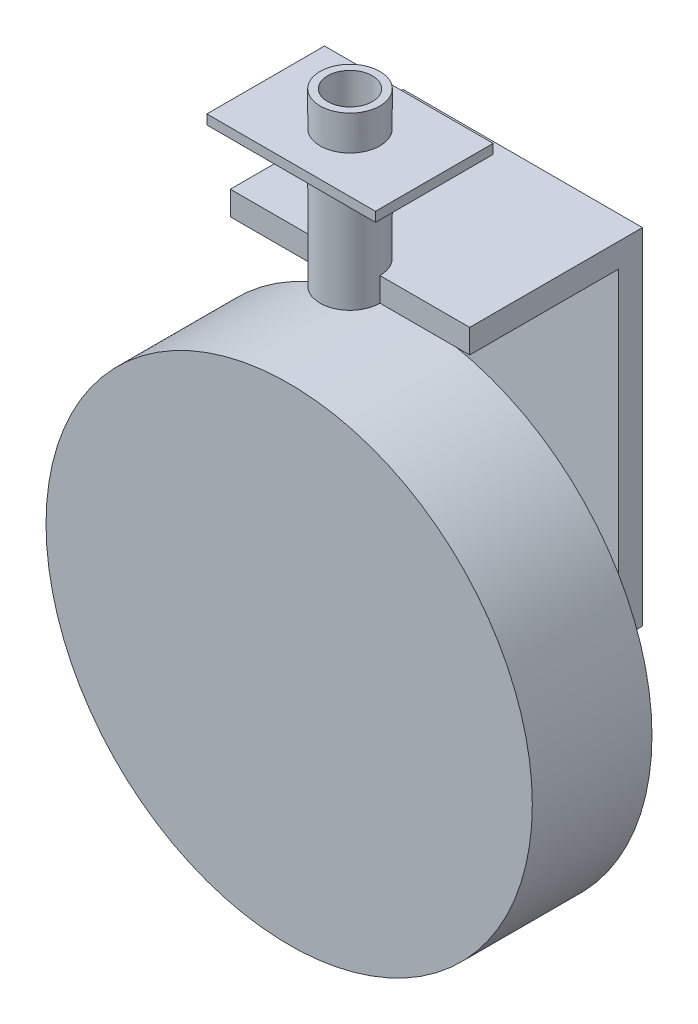
ISO-10303-21;
HEADER;
FILE_DESCRIPTION(('STEP AP214'),'2;1');
FILE_NAME('part.step','',(''),(''),'','','');
FILE_SCHEMA(('AUTOMOTIVE_DESIGN { 1 0 10303 214 1 1 1 1 }'));
ENDSEC;
DATA;
#1=APPLICATION_CONTEXT('core data for automotive mechanical design processes');
#2=APPLICATION_PROTOCOL_DEFINITION('international standard','automotive_design',2000,#1);
#3=PRODUCT_CONTEXT('',#1,'mechanical');
#4=PRODUCT('Part','Part','',(#3));
#5=PRODUCT_RELATED_PRODUCT_CATEGORY('part','',(#4));
#6=PRODUCT_DEFINITION_FORMATION('','',#4);
#7=PRODUCT_DEFINITION_CONTEXT('part definition',#1,'design');
#8=PRODUCT_DEFINITION('design','',#6,#7);
#9=PRODUCT_DEFINITION_SHAPE('','',#8);
#10=(LENGTH_UNIT() NAMED_UNIT(*) SI_UNIT(.MILLI.,.METRE.));
#11=(NAMED_UNIT(*) PLANE_ANGLE_UNIT() SI_UNIT($,.RADIAN.));
#12=(NAMED_UNIT(*) SI_UNIT($,.STERADIAN.) SOLID_ANGLE_UNIT());
#13=UNCERTAINTY_MEASURE_WITH_UNIT(LENGTH_MEASURE(1.E-05),#10,'distance_accuracy_value','');
#14=(GEOMETRIC_REPRESENTATION_CONTEXT(3) GLOBAL_UNCERTAINTY_ASSIGNED_CONTEXT((#13)) GLOBAL_UNIT_ASSIGNED_CONTEXT((#10,
#11,#12)) REPRESENTATION_CONTEXT('',''));
#15=CARTESIAN_POINT('',(0.,0.,0.));
#16=DIRECTION('',(0.,0.,1.));
#17=DIRECTION('',(1.,0.,0.));
#18=AXIS2_PLACEMENT_3D('',#15,#16,#17);
#19=CARTESIAN_POINT('',(0.,124.21820320294,24.5796167587078));
#20=DIRECTION('',(0.,-1.,0.));
#21=DIRECTION('',(0.,0.,-1.));
#22=AXIS2_PLACEMENT_3D('',#19,#20,#21);
#23=CYLINDRICAL_SURFACE('',#22,12.5);
#24=DIRECTION('',(0.,-1.,0.));
#25=VECTOR('',#24,1.);
#26=CARTESIAN_POINT('',(12.5,124.21820320294,24.5796167587078));
#27=LINE('',#26,#25);
#28=CARTESIAN_POINT('',(12.5,134.21820320294,24.5796167587078));
#29=VERTEX_POINT('',#28);
#30=CARTESIAN_POINT('',(12.5,124.21820320294,24.5796167587078));
#31=VERTEX_POINT('',#30);
#32=EDGE_CURVE('E254',#29,#31,#27,.T.);
#33=ORIENTED_EDGE('',*,*,#32,.F.);
#34=CARTESIAN_POINT('',(0.,134.21820320294,24.5796167587078));
#35=DIRECTION('',(0.,1.,0.));
#36=DIRECTION('',(0.,0.,1.));
#37=AXIS2_PLACEMENT_3D('',#34,#35,#36);
#38=CIRCLE('',#37,12.5);
#39=CARTESIAN_POINT('',(-12.5,134.21820320294,24.5796167587078));
#40=VERTEX_POINT('',#39);
#41=EDGE_CURVE('E52',#29,#40,#38,.T.);
#42=ORIENTED_EDGE('',*,*,#41,.T.);
#43=DIRECTION('',(0.,-1.,0.));
#44=VECTOR('',#43,1.);
#45=CARTESIAN_POINT('',(-12.5,124.21820320294,24.5796167587078));
#46=LINE('',#45,#44);
#47=CARTESIAN_POINT('',(-12.5,124.21820320294,24.5796167587078));
#48=VERTEX_POINT('',#47);
#49=EDGE_CURVE('E60',#48,#40,#46,.F.);
#50=ORIENTED_EDGE('',*,*,#49,.F.);
#51=CARTESIAN_POINT('',(0.,124.21820320294,24.5796167587078));
#52=DIRECTION('',(0.,-1.,0.));
#53=DIRECTION('',(0.,0.,-1.));
#54=AXIS2_PLACEMENT_3D('',#51,#52,#53);
#55=CIRCLE('',#54,12.5);
#56=EDGE_CURVE('E181',#31,#48,#55,.T.);
#57=ORIENTED_EDGE('',*,*,#56,.F.);
#58=EDGE_LOOP('',(#33,#42,#50,#57));
#59=FACE_BOUND('',#58,.T.);
#60=CARTESIAN_POINT('',(0.,177.126182074374,24.5796167587078));
#61=DIRECTION('',(0.,1.,0.));
#62=DIRECTION('',(0.,0.,1.));
#63=AXIS2_PLACEMENT_3D('',#60,#61,#62);
#64=CIRCLE('',#63,12.5);
#65=CARTESIAN_POINT('',(0.,177.126182074374,37.0796167587078));
#66=VERTEX_POINT('',#65);
#67=EDGE_CURVE('E164',#66,#66,#64,.F.);
#68=ORIENTED_EDGE('',*,*,#67,.T.);
#69=EDGE_LOOP('',(#68));
#70=FACE_BOUND('',#69,.T.);
#71=ADVANCED_FACE('F34',(#59,#70),#23,.T.);
#72=CARTESIAN_POINT('',(-50.,124.21820320294,24.5796167587078));
#73=DIRECTION('',(0.,0.,-1.));
#74=DIRECTION('',(-1.,0.,0.));
#75=AXIS2_PLACEMENT_3D('',#72,#73,#74);
#76=PLANE('',#75);
#77=DIRECTION('',(1.,0.,0.));
#78=VECTOR('',#77,1.);
#79=CARTESIAN_POINT('',(-50.,134.21820320294,24.5796167587078));
#80=LINE('',#79,#78);
#81=CARTESIAN_POINT('',(50.,134.21820320294,24.5796167587078));
#82=VERTEX_POINT('',#81);
#83=EDGE_CURVE('E220',#29,#82,#80,.T.);
#84=ORIENTED_EDGE('',*,*,#83,.F.);
#85=ORIENTED_EDGE('',*,*,#32,.T.);
#86=DIRECTION('',(1.,0.,0.));
#87=VECTOR('',#86,1.);
#88=CARTESIAN_POINT('',(-50.,124.21820320294,24.5796167587078));
#89=LINE('',#88,#87);
#90=CARTESIAN_POINT('',(50.,124.21820320294,24.5796167587078));
#91=VERTEX_POINT('',#90);
#92=EDGE_CURVE('E234',#31,#91,#89,.T.);
#93=ORIENTED_EDGE('',*,*,#92,.T.);
#94=DIRECTION('',(0.,1.,0.));
#95=VECTOR('',#94,1.);
#96=CARTESIAN_POINT('',(50.,124.21820320294,24.5796167587078));
#97=LINE('',#96,#95);
#98=EDGE_CURVE('E188',#91,#82,#97,.T.);
#99=ORIENTED_EDGE('',*,*,#98,.T.);
#100=EDGE_LOOP('',(#84,#85,#93,#99));
#101=FACE_BOUND('',#100,.T.);
#102=ADVANCED_FACE('F301',(#101),#76,.F.);
#103=CARTESIAN_POINT('',(0.,0.,0.));
#104=DIRECTION('',(0.,0.,1.));
#105=DIRECTION('',(1.,0.,0.));
#106=AXIS2_PLACEMENT_3D('',#103,#104,#105);
#107=PLANE('',#106);
#108=CARTESIAN_POINT('',(0.,0.,0.));
#109=DIRECTION('',(0.,0.,1.));
#110=DIRECTION('',(1.,0.,0.));
#111=AXIS2_PLACEMENT_3D('',#108,#109,#110);
#112=CIRCLE('',#111,101.6);
#113=CARTESIAN_POINT('',(101.6,0.,0.));
#114=VERTEX_POINT('',#113);
#115=EDGE_CURVE('E223',#114,#114,#112,.T.);
#116=ORIENTED_EDGE('',*,*,#115,.F.);
#117=EDGE_LOOP('',(#116));
#118=FACE_BOUND('',#117,.T.);
#119=DIRECTION('',(0.,1.,0.));
#120=VECTOR('',#119,1.);
#121=CARTESIAN_POINT('',(-50.,0.,0.));
#122=LINE('',#121,#120);
#123=CARTESIAN_POINT('',(-50.,-10.,0.));
#124=VERTEX_POINT('',#123);
#125=CARTESIAN_POINT('',(-50.,0.,0.));
#126=VERTEX_POINT('',#125);
#127=EDGE_CURVE('E251',#124,#126,#122,.T.);
#128=ORIENTED_EDGE('',*,*,#127,.F.);
#129=DIRECTION('',(1.,0.,0.));
#130=VECTOR('',#129,1.);
#131=CARTESIAN_POINT('',(0.,-10.,0.));
#132=LINE('',#131,#130);
#133=CARTESIAN_POINT('',(50.,-10.,0.));
#134=VERTEX_POINT('',#133);
#135=EDGE_CURVE('E248',#124,#134,#132,.T.);
#136=ORIENTED_EDGE('',*,*,#135,.T.);
#137=DIRECTION('',(0.,1.,0.));
#138=VECTOR('',#137,1.);
#139=CARTESIAN_POINT('',(50.,0.,0.));
#140=LINE('',#139,#138);
#141=CARTESIAN_POINT('',(50.,0.,0.));
#142=VERTEX_POINT('',#141);
#143=EDGE_CURVE('E240',#134,#142,#140,.T.);
#144=ORIENTED_EDGE('',*,*,#143,.T.);
#145=DIRECTION('',(1.,0.,0.));
#146=VECTOR('',#145,1.);
#147=CARTESIAN_POINT('',(0.,0.,0.));
#148=LINE('',#147,#146);
#149=EDGE_CURVE('E245',#126,#142,#148,.T.);
#150=ORIENTED_EDGE('',*,*,#149,.F.);
#151=EDGE_LOOP('',(#128,#136,#144,#150));
#152=FACE_BOUND('',#151,.T.);
#153=ADVANCED_FACE('F308',(#118,#152),#107,.F.);
#154=CARTESIAN_POINT('',(0.,0.,50.));
#155=DIRECTION('',(0.,0.,-1.));
#156=DIRECTION('',(-1.,0.,0.));
#157=AXIS2_PLACEMENT_3D('',#154,#155,#156);
#158=CYLINDRICAL_SURFACE('',#157,101.6);
#159=CARTESIAN_POINT('',(0.,0.,50.));
#160=DIRECTION('',(0.,0.,1.));
#161=DIRECTION('',(1.,0.,0.));
#162=AXIS2_PLACEMENT_3D('',#159,#160,#161);
#163=CIRCLE('',#162,101.6);
#164=CARTESIAN_POINT('',(101.6,0.,50.));
#165=VERTEX_POINT('',#164);
#166=EDGE_CURVE('E237',#165,#165,#163,.T.);
#167=ORIENTED_EDGE('',*,*,#166,.F.);
#168=EDGE_LOOP('',(#167));
#169=FACE_BOUND('',#168,.T.);
#170=ORIENTED_EDGE('',*,*,#115,.T.);
#171=EDGE_LOOP('',(#170));
#172=FACE_BOUND('',#171,.T.);
#173=ADVANCED_FACE('F36',(#169,#172),#158,.T.);
#174=CARTESIAN_POINT('',(0.,0.,50.));
#175=DIRECTION('',(0.,0.,1.));
#176=DIRECTION('',(1.,0.,0.));
#177=AXIS2_PLACEMENT_3D('',#174,#175,#176);
#178=PLANE('',#177);
#179=ORIENTED_EDGE('',*,*,#166,.T.);
#180=EDGE_LOOP('',(#179));
#181=FACE_BOUND('',#180,.T.);
#182=ADVANCED_FACE('F333',(#181),#178,.T.);
#183=CARTESIAN_POINT('',(-50.,-10.,24.5796167587078));
#184=DIRECTION('',(0.,-1.,0.));
#185=DIRECTION('',(0.,0.,-1.));
#186=AXIS2_PLACEMENT_3D('',#183,#184,#185);
#187=PLANE('',#186);
#188=ORIENTED_EDGE('',*,*,#135,.F.);
#189=DIRECTION('',(0.,0.,-1.));
#190=VECTOR('',#189,1.);
#191=CARTESIAN_POINT('',(-50.,-10.,24.5796167587078));
#192=LINE('',#191,#190);
#193=CARTESIAN_POINT('',(-50.,-10.,-47.6371029525332));
#194=VERTEX_POINT('',#193);
#195=EDGE_CURVE('E215',#124,#194,#192,.T.);
#196=ORIENTED_EDGE('',*,*,#195,.T.);
#197=DIRECTION('',(1.,0.,0.));
#198=VECTOR('',#197,1.);
#199=CARTESIAN_POINT('',(-50.,-10.,-47.6371029525332));
#200=LINE('',#199,#198);
#201=CARTESIAN_POINT('',(50.,-10.,-47.6371029525332));
#202=VERTEX_POINT('',#201);
#203=EDGE_CURVE('E224',#194,#202,#200,.T.);
#204=ORIENTED_EDGE('',*,*,#203,.T.);
#205=DIRECTION('',(0.,0.,-1.));
#206=VECTOR('',#205,1.);
#207=CARTESIAN_POINT('',(50.,-10.,24.5796167587078));
#208=LINE('',#207,#206);
#209=EDGE_CURVE('E199',#134,#202,#208,.T.);
#210=ORIENTED_EDGE('',*,*,#209,.F.);
#211=EDGE_LOOP('',(#188,#196,#204,#210));
#212=FACE_BOUND('',#211,.T.);
#213=ADVANCED_FACE('F330',(#212),#187,.T.);
#214=CARTESIAN_POINT('',(-50.,0.,24.5796167587078));
#215=DIRECTION('',(0.,-1.,0.));
#216=DIRECTION('',(0.,0.,-1.));
#217=AXIS2_PLACEMENT_3D('',#214,#215,#216);
#218=PLANE('',#217);
#219=DIRECTION('',(0.,0.,-1.));
#220=VECTOR('',#219,1.);
#221=CARTESIAN_POINT('',(-50.,0.,24.5796167587078));
#222=LINE('',#221,#220);
#223=CARTESIAN_POINT('',(-50.,0.,-37.6371029525332));
#224=VERTEX_POINT('',#223);
#225=EDGE_CURVE('E213',#126,#224,#222,.T.);
#226=ORIENTED_EDGE('',*,*,#225,.F.);
#227=ORIENTED_EDGE('',*,*,#149,.T.);
#228=DIRECTION('',(0.,0.,-1.));
#229=VECTOR('',#228,1.);
#230=CARTESIAN_POINT('',(50.,0.,24.5796167587078));
#231=LINE('',#230,#229);
#232=CARTESIAN_POINT('',(50.,0.,-37.6371029525332));
#233=VERTEX_POINT('',#232);
#234=EDGE_CURVE('E197',#142,#233,#231,.T.);
#235=ORIENTED_EDGE('',*,*,#234,.T.);
#236=DIRECTION('',(1.,0.,0.));
#237=VECTOR('',#236,1.);
#238=CARTESIAN_POINT('',(-50.,0.,-37.6371029525332));
#239=LINE('',#238,#237);
#240=EDGE_CURVE('E227',#224,#233,#239,.T.);
#241=ORIENTED_EDGE('',*,*,#240,.F.);
#242=EDGE_LOOP('',(#226,#227,#235,#241));
#243=FACE_BOUND('',#242,.T.);
#244=ADVANCED_FACE('F323',(#243),#218,.F.);
#245=CARTESIAN_POINT('',(-50.,0.,0.));
#246=DIRECTION('',(1.,0.,0.));
#247=DIRECTION('',(0.,0.,-1.));
#248=AXIS2_PLACEMENT_3D('',#245,#246,#247);
#249=PLANE('',#248);
#250=ORIENTED_EDGE('',*,*,#195,.F.);
#251=ORIENTED_EDGE('',*,*,#127,.T.);
#252=ORIENTED_EDGE('',*,*,#225,.T.);
#253=DIRECTION('',(0.,1.,0.));
#254=VECTOR('',#253,1.);
#255=CARTESIAN_POINT('',(-50.,0.,-37.6371029525332));
#256=LINE('',#255,#254);
#257=CARTESIAN_POINT('',(-50.,124.21820320294,-37.6371029525332));
#258=VERTEX_POINT('',#257);
#259=EDGE_CURVE('E211',#224,#258,#256,.T.);
#260=ORIENTED_EDGE('',*,*,#259,.T.);
#261=DIRECTION('',(0.,0.,1.));
#262=VECTOR('',#261,1.);
#263=CARTESIAN_POINT('',(-50.,124.21820320294,-37.6371029525332));
#264=LINE('',#263,#262);
#265=CARTESIAN_POINT('',(-50.,124.21820320294,24.5796167587078));
#266=VERTEX_POINT('',#265);
#267=EDGE_CURVE('E209',#258,#266,#264,.T.);
#268=ORIENTED_EDGE('',*,*,#267,.T.);
#269=DIRECTION('',(0.,1.,0.));
#270=VECTOR('',#269,1.);
#271=CARTESIAN_POINT('',(-50.,124.21820320294,24.5796167587078));
#272=LINE('',#271,#270);
#273=CARTESIAN_POINT('',(-50.,134.21820320294,24.5796167587078));
#274=VERTEX_POINT('',#273);
#275=EDGE_CURVE('E207',#266,#274,#272,.T.);
#276=ORIENTED_EDGE('',*,*,#275,.T.);
#277=DIRECTION('',(0.,0.,-1.));
#278=VECTOR('',#277,1.);
#279=CARTESIAN_POINT('',(-50.,134.21820320294,-37.6371029525332));
#280=LINE('',#279,#278);
#281=CARTESIAN_POINT('',(-50.,134.21820320294,-47.6371029525332));
#282=VERTEX_POINT('',#281);
#283=EDGE_CURVE('E204',#282,#274,#280,.F.);
#284=ORIENTED_EDGE('',*,*,#283,.F.);
#285=DIRECTION('',(0.,1.,0.));
#286=VECTOR('',#285,1.);
#287=CARTESIAN_POINT('',(-50.,0.,-47.6371029525332));
#288=LINE('',#287,#286);
#289=EDGE_CURVE('E217',#194,#282,#288,.T.);
#290=ORIENTED_EDGE('',*,*,#289,.F.);
#291=EDGE_LOOP('',(#250,#251,#252,#260,#268,#276,#284,#290));
#292=FACE_BOUND('',#291,.T.);
#293=ADVANCED_FACE('F319',(#292),#249,.F.);
#294=CARTESIAN_POINT('',(50.,0.,0.));
#295=DIRECTION('',(1.,0.,0.));
#296=DIRECTION('',(0.,0.,-1.));
#297=AXIS2_PLACEMENT_3D('',#294,#295,#296);
#298=PLANE('',#297);
#299=ORIENTED_EDGE('',*,*,#143,.F.);
#300=ORIENTED_EDGE('',*,*,#209,.T.);
#301=DIRECTION('',(0.,1.,0.));
#302=VECTOR('',#301,1.);
#303=CARTESIAN_POINT('',(50.,0.,-47.6371029525332));
#304=LINE('',#303,#302);
#305=CARTESIAN_POINT('',(50.,134.21820320294,-47.6371029525332));
#306=VERTEX_POINT('',#305);
#307=EDGE_CURVE('E201',#202,#306,#304,.T.);
#308=ORIENTED_EDGE('',*,*,#307,.T.);
#309=DIRECTION('',(0.,0.,-1.));
#310=VECTOR('',#309,1.);
#311=CARTESIAN_POINT('',(50.,134.21820320294,-37.6371029525332));
#312=LINE('',#311,#310);
#313=EDGE_CURVE('E185',#306,#82,#312,.F.);
#314=ORIENTED_EDGE('',*,*,#313,.T.);
#315=ORIENTED_EDGE('',*,*,#98,.F.);
#316=DIRECTION('',(0.,0.,1.));
#317=VECTOR('',#316,1.);
#318=CARTESIAN_POINT('',(50.,124.21820320294,-37.6371029525332));
#319=LINE('',#318,#317);
#320=CARTESIAN_POINT('',(50.,124.21820320294,-37.6371029525332));
#321=VERTEX_POINT('',#320);
#322=EDGE_CURVE('E191',#321,#91,#319,.T.);
#323=ORIENTED_EDGE('',*,*,#322,.F.);
#324=DIRECTION('',(0.,1.,0.));
#325=VECTOR('',#324,1.);
#326=CARTESIAN_POINT('',(50.,0.,-37.6371029525332));
#327=LINE('',#326,#325);
#328=EDGE_CURVE('E194',#233,#321,#327,.T.);
#329=ORIENTED_EDGE('',*,*,#328,.F.);
#330=ORIENTED_EDGE('',*,*,#234,.F.);
#331=EDGE_LOOP('',(#299,#300,#308,#314,#315,#323,#329,#330));
#332=FACE_BOUND('',#331,.T.);
#333=ADVANCED_FACE('F315',(#332),#298,.T.);
#334=CARTESIAN_POINT('',(-50.,134.21820320294,-37.6371029525332));
#335=DIRECTION('',(0.,1.,0.));
#336=DIRECTION('',(0.,0.,1.));
#337=AXIS2_PLACEMENT_3D('',#334,#335,#336);
#338=PLANE('',#337);
#339=ORIENTED_EDGE('',*,*,#41,.F.);
#340=ORIENTED_EDGE('',*,*,#83,.T.);
#341=ORIENTED_EDGE('',*,*,#313,.F.);
#342=DIRECTION('',(1.,0.,0.));
#343=VECTOR('',#342,1.);
#344=CARTESIAN_POINT('',(-50.,134.21820320294,-47.6371029525332));
#345=LINE('',#344,#343);
#346=EDGE_CURVE('E221',#282,#306,#345,.T.);
#347=ORIENTED_EDGE('',*,*,#346,.F.);
#348=ORIENTED_EDGE('',*,*,#283,.T.);
#349=EDGE_CURVE('E235',#274,#40,#80,.T.);
#350=ORIENTED_EDGE('',*,*,#349,.T.);
#351=EDGE_LOOP('',(#339,#340,#341,#347,#348,#350));
#352=FACE_BOUND('',#351,.T.);
#353=ADVANCED_FACE('F318',(#352),#338,.T.);
#354=CARTESIAN_POINT('',(-50.,0.,-47.6371029525332));
#355=DIRECTION('',(0.,0.,-1.));
#356=DIRECTION('',(-1.,0.,0.));
#357=AXIS2_PLACEMENT_3D('',#354,#355,#356);
#358=PLANE('',#357);
#359=ORIENTED_EDGE('',*,*,#346,.T.);
#360=ORIENTED_EDGE('',*,*,#307,.F.);
#361=ORIENTED_EDGE('',*,*,#203,.F.);
#362=ORIENTED_EDGE('',*,*,#289,.T.);
#363=EDGE_LOOP('',(#359,#360,#361,#362));
#364=FACE_BOUND('',#363,.T.);
#365=ADVANCED_FACE('F325',(#364),#358,.T.);
#366=CARTESIAN_POINT('',(-50.,0.,-37.6371029525332));
#367=DIRECTION('',(0.,0.,-1.));
#368=DIRECTION('',(-1.,0.,0.));
#369=AXIS2_PLACEMENT_3D('',#366,#367,#368);
#370=PLANE('',#369);
#371=ORIENTED_EDGE('',*,*,#240,.T.);
#372=ORIENTED_EDGE('',*,*,#328,.T.);
#373=DIRECTION('',(1.,0.,0.));
#374=VECTOR('',#373,1.);
#375=CARTESIAN_POINT('',(-50.,124.21820320294,-37.6371029525332));
#376=LINE('',#375,#374);
#377=EDGE_CURVE('E230',#258,#321,#376,.T.);
#378=ORIENTED_EDGE('',*,*,#377,.F.);
#379=ORIENTED_EDGE('',*,*,#259,.F.);
#380=EDGE_LOOP('',(#371,#372,#378,#379));
#381=FACE_BOUND('',#380,.T.);
#382=ADVANCED_FACE('F328',(#381),#370,.F.);
#383=CARTESIAN_POINT('',(-50.,124.21820320294,-37.6371029525332));
#384=DIRECTION('',(0.,1.,0.));
#385=DIRECTION('',(0.,0.,1.));
#386=AXIS2_PLACEMENT_3D('',#383,#384,#385);
#387=PLANE('',#386);
#388=ORIENTED_EDGE('',*,*,#92,.F.);
#389=ORIENTED_EDGE('',*,*,#56,.T.);
#390=EDGE_CURVE('E232',#266,#48,#89,.T.);
#391=ORIENTED_EDGE('',*,*,#390,.F.);
#392=ORIENTED_EDGE('',*,*,#267,.F.);
#393=ORIENTED_EDGE('',*,*,#377,.T.);
#394=ORIENTED_EDGE('',*,*,#322,.T.);
#395=EDGE_LOOP('',(#388,#389,#391,#392,#393,#394));
#396=FACE_BOUND('',#395,.T.);
#397=ADVANCED_FACE('F340',(#396),#387,.F.);
#398=ORIENTED_EDGE('',*,*,#390,.T.);
#399=ORIENTED_EDGE('',*,*,#49,.T.);
#400=ORIENTED_EDGE('',*,*,#349,.F.);
#401=ORIENTED_EDGE('',*,*,#275,.F.);
#402=EDGE_LOOP('',(#398,#399,#400,#401));
#403=FACE_BOUND('',#402,.T.);
#404=ADVANCED_FACE('F311',(#403),#76,.F.);
#405=CARTESIAN_POINT('',(-35.2328413119452,181.126182074374,49.1592335174156));
#406=DIRECTION('',(1.,0.,0.));
#407=DIRECTION('',(0.,0.,-1.));
#408=AXIS2_PLACEMENT_3D('',#405,#406,#407);
#409=PLANE('',#408);
#410=DIRECTION('',(0.,0.,1.));
#411=VECTOR('',#410,1.);
#412=CARTESIAN_POINT('',(-35.2328413119452,177.126182074374,49.1592335174156));
#413=LINE('',#412,#411);
#414=CARTESIAN_POINT('',(-35.2328413119452,177.126182074374,0.));
#415=VERTEX_POINT('',#414);
#416=CARTESIAN_POINT('',(-35.2328413119452,177.126182074374,49.1592335174156));
#417=VERTEX_POINT('',#416);
#418=EDGE_CURVE('E163',#415,#417,#413,.T.);
#419=ORIENTED_EDGE('',*,*,#418,.T.);
#420=DIRECTION('',(0.,-1.,0.));
#421=VECTOR('',#420,1.);
#422=CARTESIAN_POINT('',(-35.2328413119452,181.126182074374,49.1592335174156));
#423=LINE('',#422,#421);
#424=CARTESIAN_POINT('',(-35.2328413119452,181.126182074374,49.1592335174156));
#425=VERTEX_POINT('',#424);
#426=EDGE_CURVE('E143',#425,#417,#423,.T.);
#427=ORIENTED_EDGE('',*,*,#426,.F.);
#428=DIRECTION('',(0.,0.,1.));
#429=VECTOR('',#428,1.);
#430=CARTESIAN_POINT('',(-35.2328413119452,181.126182074374,49.1592335174156));
#431=LINE('',#430,#429);
#432=CARTESIAN_POINT('',(-35.2328413119452,181.126182074374,0.));
#433=VERTEX_POINT('',#432);
#434=EDGE_CURVE('E150',#433,#425,#431,.T.);
#435=ORIENTED_EDGE('',*,*,#434,.F.);
#436=DIRECTION('',(0.,-1.,0.));
#437=VECTOR('',#436,1.);
#438=CARTESIAN_POINT('',(-35.2328413119452,181.126182074374,0.));
#439=LINE('',#438,#437);
#440=EDGE_CURVE('E555',#433,#415,#439,.T.);
#441=ORIENTED_EDGE('',*,*,#440,.T.);
#442=EDGE_LOOP('',(#419,#427,#435,#441));
#443=FACE_BOUND('',#442,.T.);
#444=ADVANCED_FACE('F161',(#443),#409,.F.);
#445=CARTESIAN_POINT('',(35.2328413119452,181.126182074374,49.1592335174156));
#446=DIRECTION('',(0.,0.,-1.));
#447=DIRECTION('',(-1.,0.,0.));
#448=AXIS2_PLACEMENT_3D('',#445,#446,#447);
#449=PLANE('',#448);
#450=DIRECTION('',(1.,0.,0.));
#451=VECTOR('',#450,1.);
#452=CARTESIAN_POINT('',(35.2328413119452,177.126182074374,49.1592335174156));
#453=LINE('',#452,#451);
#454=CARTESIAN_POINT('',(35.2328413119452,177.126182074374,49.1592335174156));
#455=VERTEX_POINT('',#454);
#456=EDGE_CURVE('E561',#417,#455,#453,.T.);
#457=ORIENTED_EDGE('',*,*,#456,.T.);
#458=DIRECTION('',(0.,-1.,0.));
#459=VECTOR('',#458,1.);
#460=CARTESIAN_POINT('',(35.2328413119452,181.126182074374,49.1592335174156));
#461=LINE('',#460,#459);
#462=CARTESIAN_POINT('',(35.2328413119452,181.126182074374,49.1592335174156));
#463=VERTEX_POINT('',#462);
#464=EDGE_CURVE('E146',#463,#455,#461,.T.);
#465=ORIENTED_EDGE('',*,*,#464,.F.);
#466=DIRECTION('',(1.,0.,0.));
#467=VECTOR('',#466,1.);
#468=CARTESIAN_POINT('',(35.2328413119452,181.126182074374,49.1592335174156));
#469=LINE('',#468,#467);
#470=EDGE_CURVE('E139',#425,#463,#469,.T.);
#471=ORIENTED_EDGE('',*,*,#470,.F.);
#472=ORIENTED_EDGE('',*,*,#426,.T.);
#473=EDGE_LOOP('',(#457,#465,#471,#472));
#474=FACE_BOUND('',#473,.T.);
#475=ADVANCED_FACE('F141',(#474),#449,.F.);
#476=CARTESIAN_POINT('',(35.2328413119452,181.126182074374,49.1592335174156));
#477=DIRECTION('',(-1.,0.,0.));
#478=DIRECTION('',(0.,0.,1.));
#479=AXIS2_PLACEMENT_3D('',#476,#477,#478);
#480=PLANE('',#479);
#481=DIRECTION('',(0.,0.,-1.));
#482=VECTOR('',#481,1.);
#483=CARTESIAN_POINT('',(35.2328413119452,177.126182074374,49.1592335174156));
#484=LINE('',#483,#482);
#485=CARTESIAN_POINT('',(35.2328413119452,177.126182074374,0.));
#486=VERTEX_POINT('',#485);
#487=EDGE_CURVE('E558',#455,#486,#484,.T.);
#488=ORIENTED_EDGE('',*,*,#487,.T.);
#489=DIRECTION('',(0.,-1.,0.));
#490=VECTOR('',#489,1.);
#491=CARTESIAN_POINT('',(35.2328413119452,181.126182074374,0.));
#492=LINE('',#491,#490);
#493=CARTESIAN_POINT('',(35.2328413119452,181.126182074374,0.));
#494=VERTEX_POINT('',#493);
#495=EDGE_CURVE('E168',#494,#486,#492,.T.);
#496=ORIENTED_EDGE('',*,*,#495,.F.);
#497=DIRECTION('',(0.,0.,-1.));
#498=VECTOR('',#497,1.);
#499=CARTESIAN_POINT('',(35.2328413119452,181.126182074374,49.1592335174156));
#500=LINE('',#499,#498);
#501=EDGE_CURVE('E149',#463,#494,#500,.T.);
#502=ORIENTED_EDGE('',*,*,#501,.F.);
#503=ORIENTED_EDGE('',*,*,#464,.T.);
#504=EDGE_LOOP('',(#488,#496,#502,#503));
#505=FACE_BOUND('',#504,.T.);
#506=ADVANCED_FACE('F456',(#505),#480,.F.);
#507=CARTESIAN_POINT('',(35.2328413119452,181.126182074374,0.));
#508=DIRECTION('',(0.,0.,1.));
#509=DIRECTION('',(1.,0.,0.));
#510=AXIS2_PLACEMENT_3D('',#507,#508,#509);
#511=PLANE('',#510);
#512=DIRECTION('',(-1.,0.,0.));
#513=VECTOR('',#512,1.);
#514=CARTESIAN_POINT('',(35.2328413119452,177.126182074374,0.));
#515=LINE('',#514,#513);
#516=EDGE_CURVE('E159',#486,#415,#515,.T.);
#517=ORIENTED_EDGE('',*,*,#516,.T.);
#518=ORIENTED_EDGE('',*,*,#440,.F.);
#519=DIRECTION('',(-1.,0.,0.));
#520=VECTOR('',#519,1.);
#521=CARTESIAN_POINT('',(35.2328413119452,181.126182074374,0.));
#522=LINE('',#521,#520);
#523=EDGE_CURVE('E155',#494,#433,#522,.T.);
#524=ORIENTED_EDGE('',*,*,#523,.F.);
#525=ORIENTED_EDGE('',*,*,#495,.T.);
#526=EDGE_LOOP('',(#517,#518,#524,#525));
#527=FACE_BOUND('',#526,.T.);
#528=ADVANCED_FACE('F296',(#527),#511,.F.);
#529=CARTESIAN_POINT('',(0.,181.126182074374,0.));
#530=DIRECTION('',(0.,1.,0.));
#531=DIRECTION('',(0.,0.,1.));
#532=AXIS2_PLACEMENT_3D('',#529,#530,#531);
#533=PLANE('',#532);
#534=CARTESIAN_POINT('',(0.,181.126182074374,24.5796167587078));
#535=DIRECTION('',(0.,1.,0.));
#536=DIRECTION('',(0.,0.,1.));
#537=AXIS2_PLACEMENT_3D('',#534,#535,#536);
#538=CIRCLE('',#537,12.5);
#539=CARTESIAN_POINT('',(0.,181.126182074374,37.0796167587078));
#540=VERTEX_POINT('',#539);
#541=EDGE_CURVE('E11',#540,#540,#538,.F.);
#542=ORIENTED_EDGE('',*,*,#541,.T.);
#543=EDGE_LOOP('',(#542));
#544=FACE_BOUND('',#543,.T.);
#545=ORIENTED_EDGE('',*,*,#434,.T.);
#546=ORIENTED_EDGE('',*,*,#470,.T.);
#547=ORIENTED_EDGE('',*,*,#501,.T.);
#548=ORIENTED_EDGE('',*,*,#523,.T.);
#549=EDGE_LOOP('',(#545,#546,#547,#548));
#550=FACE_BOUND('',#549,.T.);
#551=ADVANCED_FACE('F153',(#544,#550),#533,.T.);
#552=CARTESIAN_POINT('',(0.,177.126182074374,0.));
#553=DIRECTION('',(0.,1.,0.));
#554=DIRECTION('',(0.,0.,1.));
#555=AXIS2_PLACEMENT_3D('',#552,#553,#554);
#556=PLANE('',#555);
#557=ORIENTED_EDGE('',*,*,#67,.F.);
#558=EDGE_LOOP('',(#557));
#559=FACE_BOUND('',#558,.T.);
#560=ORIENTED_EDGE('',*,*,#418,.F.);
#561=ORIENTED_EDGE('',*,*,#516,.F.);
#562=ORIENTED_EDGE('',*,*,#487,.F.);
#563=ORIENTED_EDGE('',*,*,#456,.F.);
#564=EDGE_LOOP('',(#560,#561,#562,#563));
#565=FACE_BOUND('',#564,.T.);
#566=ADVANCED_FACE('F281',(#559,#565),#556,.F.);
#567=ORIENTED_EDGE('',*,*,#541,.F.);
#568=EDGE_LOOP('',(#567));
#569=FACE_BOUND('',#568,.T.);
#570=CARTESIAN_POINT('',(0.,195.589708201335,24.5796167587078));
#571=DIRECTION('',(0.,-1.,0.));
#572=DIRECTION('',(0.,0.,-1.));
#573=AXIS2_PLACEMENT_3D('',#570,#571,#572);
#574=CIRCLE('',#573,12.5);
#575=CARTESIAN_POINT('',(0.,195.589708201335,12.0796167587078));
#576=VERTEX_POINT('',#575);
#577=EDGE_CURVE('E175',#576,#576,#574,.T.);
#578=ORIENTED_EDGE('',*,*,#577,.T.);
#579=EDGE_LOOP('',(#578));
#580=FACE_BOUND('',#579,.T.);
#581=ADVANCED_FACE('F288',(#569,#580),#23,.T.);
#582=CARTESIAN_POINT('',(0.,195.589708201335,24.5796167587078));
#583=DIRECTION('',(0.,-1.,0.));
#584=DIRECTION('',(0.,0.,-1.));
#585=AXIS2_PLACEMENT_3D('',#582,#583,#584);
#586=PLANE('',#585);
#587=CARTESIAN_POINT('',(0.,195.589708201335,24.5796167587078));
#588=DIRECTION('',(0.,1.,0.));
#589=DIRECTION('',(0.,0.,1.));
#590=AXIS2_PLACEMENT_3D('',#587,#588,#589);
#591=CIRCLE('',#590,9.36611358722719);
#592=CARTESIAN_POINT('',(0.,195.589708201335,33.945730345935));
#593=VERTEX_POINT('',#592);
#594=EDGE_CURVE('E176',#593,#593,#591,.T.);
#595=ORIENTED_EDGE('',*,*,#594,.F.);
#596=EDGE_LOOP('',(#595));
#597=FACE_BOUND('',#596,.T.);
#598=ORIENTED_EDGE('',*,*,#577,.F.);
#599=EDGE_LOOP('',(#598));
#600=FACE_BOUND('',#599,.T.);
#601=ADVANCED_FACE('F277',(#597,#600),#586,.F.);
#602=CARTESIAN_POINT('',(0.,145.589708201335,24.5796167587078));
#603=DIRECTION('',(0.,1.,0.));
#604=DIRECTION('',(0.,0.,1.));
#605=AXIS2_PLACEMENT_3D('',#602,#603,#604);
#606=CYLINDRICAL_SURFACE('',#605,9.36611358722719);
#607=CARTESIAN_POINT('',(0.,181.126182074374,24.5796167587078));
#608=DIRECTION('',(0.,1.,0.));
#609=DIRECTION('',(0.,0.,1.));
#610=AXIS2_PLACEMENT_3D('',#607,#608,#609);
#611=CIRCLE('',#610,9.36611358722719);
#612=CARTESIAN_POINT('',(0.,181.126182074374,33.945730345935));
#613=VERTEX_POINT('',#612);
#614=EDGE_CURVE('E38',#613,#613,#611,.F.);
#615=ORIENTED_EDGE('',*,*,#614,.T.);
#616=EDGE_LOOP('',(#615));
#617=FACE_BOUND('',#616,.T.);
#618=ORIENTED_EDGE('',*,*,#594,.T.);
#619=EDGE_LOOP('',(#618));
#620=FACE_BOUND('',#619,.T.);
#621=ADVANCED_FACE('F266',(#617,#620),#606,.F.);
#622=ORIENTED_EDGE('',*,*,#614,.F.);
#623=EDGE_LOOP('',(#622));
#624=FACE_BOUND('',#623,.T.);
#625=ADVANCED_FACE('F276',(#624),#533,.T.);
#626=CLOSED_SHELL('',(#71,#102,#153,#173,#182,#213,#244,#293,#333,#353,#365,#382,#397,#404,#444,
#475,#506,#528,#551,#566,#581,#601,#621,#625));
#627=CARTESIAN_POINT('',(0.,177.126182074374,24.5796167587078));
#628=DIRECTION('',(0.,1.,0.));
#629=DIRECTION('',(0.,0.,1.));
#630=AXIS2_PLACEMENT_3D('',#627,#628,#629);
#631=CIRCLE('',#630,9.36611358722719);
#632=CARTESIAN_POINT('',(0.,177.126182074374,33.945730345935));
#633=VERTEX_POINT('',#632);
#634=EDGE_CURVE('E44',#633,#633,#631,.F.);
#635=ORIENTED_EDGE('',*,*,#634,.T.);
#636=EDGE_LOOP('',(#635));
#637=FACE_BOUND('',#636,.T.);
#638=ADVANCED_FACE('F259',(#637),#556,.F.);
#639=CARTESIAN_POINT('',(0.,145.589708201335,24.5796167587078));
#640=DIRECTION('',(0.,1.,0.));
#641=DIRECTION('',(0.,0.,1.));
#642=AXIS2_PLACEMENT_3D('',#639,#640,#641);
#643=PLANE('',#642);
#644=CARTESIAN_POINT('',(0.,145.589708201335,24.5796167587078));
#645=DIRECTION('',(0.,1.,0.));
#646=DIRECTION('',(0.,0.,1.));
#647=AXIS2_PLACEMENT_3D('',#644,#645,#646);
#648=CIRCLE('',#647,9.36611358722719);
#649=CARTESIAN_POINT('',(0.,145.589708201335,33.945730345935));
#650=VERTEX_POINT('',#649);
#651=EDGE_CURVE('E172',#650,#650,#648,.T.);
#652=ORIENTED_EDGE('',*,*,#651,.T.);
#653=EDGE_LOOP('',(#652));
#654=FACE_BOUND('',#653,.T.);
#655=ADVANCED_FACE('F263',(#654),#643,.T.);
#656=ORIENTED_EDGE('',*,*,#651,.F.);
#657=EDGE_LOOP('',(#656));
#658=FACE_BOUND('',#657,.T.);
#659=ORIENTED_EDGE('',*,*,#634,.F.);
#660=EDGE_LOOP('',(#659));
#661=FACE_BOUND('',#660,.T.);
#662=ADVANCED_FACE('F261',(#658,#661),#606,.F.);
#663=CLOSED_SHELL('',(#638,#655,#662));
#664=ORIENTED_CLOSED_SHELL('',*,#663,.T.);
#665=BREP_WITH_VOIDS('B2',#626,(#664));
#666=ADVANCED_BREP_SHAPE_REPRESENTATION('',(#18,#665),#14);
#667=SHAPE_DEFINITION_REPRESENTATION(#9,#666);
ENDSEC;
END-ISO-10303-21;
